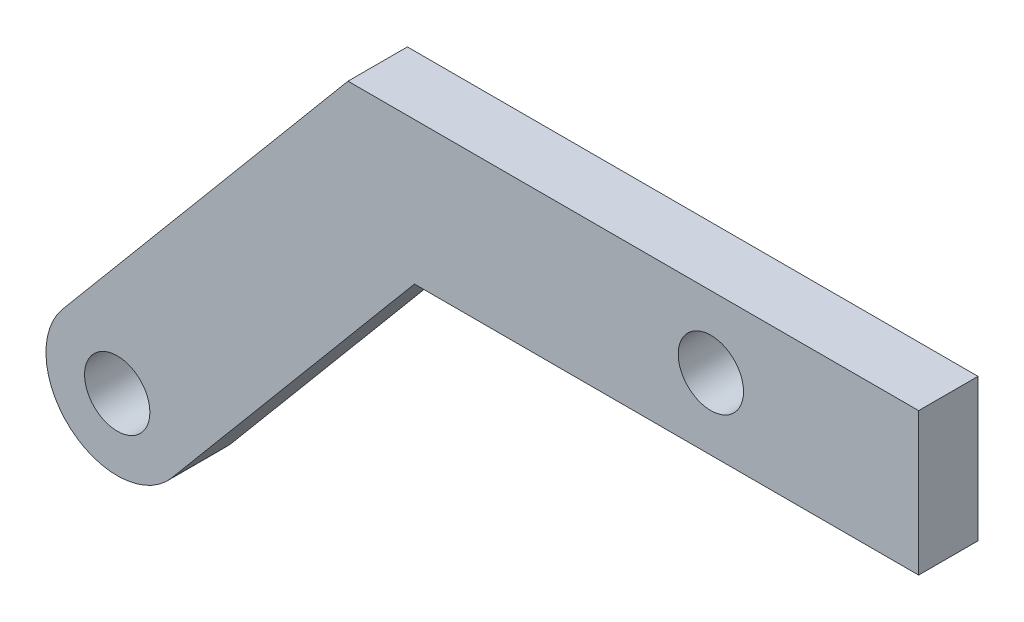
ISO-10303-21;
HEADER;
FILE_DESCRIPTION(('STEP AP214'),'2;1');
FILE_NAME('part.step','',(''),(''),'','','');
FILE_SCHEMA(('AUTOMOTIVE_DESIGN { 1 0 10303 214 1 1 1 1 }'));
ENDSEC;
DATA;
#1=APPLICATION_CONTEXT('core data for automotive mechanical design processes');
#2=APPLICATION_PROTOCOL_DEFINITION('international standard','automotive_design',2000,#1);
#3=PRODUCT_CONTEXT('',#1,'mechanical');
#4=PRODUCT('Part','Part','',(#3));
#5=PRODUCT_RELATED_PRODUCT_CATEGORY('part','',(#4));
#6=PRODUCT_DEFINITION_FORMATION('','',#4);
#7=PRODUCT_DEFINITION_CONTEXT('part definition',#1,'design');
#8=PRODUCT_DEFINITION('design','',#6,#7);
#9=PRODUCT_DEFINITION_SHAPE('','',#8);
#10=(LENGTH_UNIT() NAMED_UNIT(*) SI_UNIT(.MILLI.,.METRE.));
#11=(NAMED_UNIT(*) PLANE_ANGLE_UNIT() SI_UNIT($,.RADIAN.));
#12=(NAMED_UNIT(*) SI_UNIT($,.STERADIAN.) SOLID_ANGLE_UNIT());
#13=UNCERTAINTY_MEASURE_WITH_UNIT(LENGTH_MEASURE(1.E-05),#10,'distance_accuracy_value','');
#14=(GEOMETRIC_REPRESENTATION_CONTEXT(3) GLOBAL_UNCERTAINTY_ASSIGNED_CONTEXT((#13)) GLOBAL_UNIT_ASSIGNED_CONTEXT((#10,
#11,#12)) REPRESENTATION_CONTEXT('',''));
#15=CARTESIAN_POINT('',(0.,0.,0.));
#16=DIRECTION('',(0.,0.,1.));
#17=DIRECTION('',(1.,0.,0.));
#18=AXIS2_PLACEMENT_3D('',#15,#16,#17);
#19=CARTESIAN_POINT('',(0.,0.,10.));
#20=DIRECTION('',(0.,0.,-1.));
#21=DIRECTION('',(-1.,0.,0.));
#22=AXIS2_PLACEMENT_3D('',#19,#20,#21);
#23=CYLINDRICAL_SURFACE('',#22,12.);
#24=CARTESIAN_POINT('',(0.,0.,0.));
#25=DIRECTION('',(0.,0.,1.));
#26=DIRECTION('',(1.,0.,0.));
#27=AXIS2_PLACEMENT_3D('',#24,#25,#26);
#28=CIRCLE('',#27,12.);
#29=CARTESIAN_POINT('',(-9.19253331742775,7.71345131623845,0.));
#30=VERTEX_POINT('',#29);
#31=CARTESIAN_POINT('',(9.19253331742775,-7.71345131623846,0.));
#32=VERTEX_POINT('',#31);
#33=EDGE_CURVE('E135',#30,#32,#28,.T.);
#34=ORIENTED_EDGE('',*,*,#33,.T.);
#35=DIRECTION('',(0.,0.,-1.));
#36=VECTOR('',#35,1.);
#37=CARTESIAN_POINT('',(9.19253331742775,-7.71345131623846,10.));
#38=LINE('',#37,#36);
#39=CARTESIAN_POINT('',(9.19253331742775,-7.71345131623846,10.));
#40=VERTEX_POINT('',#39);
#41=EDGE_CURVE('E11',#40,#32,#38,.T.);
#42=ORIENTED_EDGE('',*,*,#41,.F.);
#43=CARTESIAN_POINT('',(0.,0.,10.));
#44=DIRECTION('',(0.,0.,1.));
#45=DIRECTION('',(1.,0.,0.));
#46=AXIS2_PLACEMENT_3D('',#43,#44,#45);
#47=CIRCLE('',#46,12.);
#48=CARTESIAN_POINT('',(-9.19253331742775,7.71345131623845,10.));
#49=VERTEX_POINT('',#48);
#50=EDGE_CURVE('E152',#49,#40,#47,.T.);
#51=ORIENTED_EDGE('',*,*,#50,.F.);
#52=DIRECTION('',(0.,0.,-1.));
#53=VECTOR('',#52,1.);
#54=CARTESIAN_POINT('',(-9.19253331742775,7.71345131623845,10.));
#55=LINE('',#54,#53);
#56=EDGE_CURVE('E60',#49,#30,#55,.T.);
#57=ORIENTED_EDGE('',*,*,#56,.T.);
#58=EDGE_LOOP('',(#34,#42,#51,#57));
#59=FACE_BOUND('',#58,.T.);
#60=ADVANCED_FACE('F41',(#59),#23,.T.);
#61=CARTESIAN_POINT('',(9.19253331742775,-7.71345131623846,10.));
#62=DIRECTION('',(-0.766044443118979,0.642787609686538,0.));
#63=DIRECTION('',(-0.642787609686538,-0.766044443118979,0.));
#64=AXIS2_PLACEMENT_3D('',#61,#62,#63);
#65=PLANE('',#64);
#66=DIRECTION('',(0.642787609686538,0.766044443118979,0.));
#67=VECTOR('',#66,1.);
#68=CARTESIAN_POINT('',(9.19253331742775,-7.71345131623846,0.));
#69=LINE('',#68,#67);
#70=CARTESIAN_POINT('',(50.0679723502557,41.,0.));
#71=VERTEX_POINT('',#70);
#72=EDGE_CURVE('E132',#32,#71,#69,.T.);
#73=ORIENTED_EDGE('',*,*,#72,.T.);
#74=DIRECTION('',(0.,0.,-1.));
#75=VECTOR('',#74,1.);
#76=CARTESIAN_POINT('',(50.0679723502557,41.,10.));
#77=LINE('',#76,#75);
#78=CARTESIAN_POINT('',(50.0679723502557,41.,10.));
#79=VERTEX_POINT('',#78);
#80=EDGE_CURVE('E47',#79,#71,#77,.T.);
#81=ORIENTED_EDGE('',*,*,#80,.F.);
#82=DIRECTION('',(0.642787609686538,0.766044443118979,0.));
#83=VECTOR('',#82,1.);
#84=CARTESIAN_POINT('',(9.19253331742775,-7.71345131623846,10.));
#85=LINE('',#84,#83);
#86=EDGE_CURVE('E87',#40,#79,#85,.T.);
#87=ORIENTED_EDGE('',*,*,#86,.F.);
#88=ORIENTED_EDGE('',*,*,#41,.T.);
#89=EDGE_LOOP('',(#73,#81,#87,#88));
#90=FACE_BOUND('',#89,.T.);
#91=ADVANCED_FACE('F156',(#90),#65,.F.);
#92=CARTESIAN_POINT('',(0.,41.,10.));
#93=DIRECTION('',(0.,-1.,0.));
#94=DIRECTION('',(1.,0.,0.));
#95=AXIS2_PLACEMENT_3D('',#92,#93,#94);
#96=PLANE('',#95);
#97=DIRECTION('',(-1.,0.,0.));
#98=VECTOR('',#97,1.);
#99=CARTESIAN_POINT('',(0.,41.,0.));
#100=LINE('',#99,#98);
#101=CARTESIAN_POINT('',(135.,41.,0.));
#102=VERTEX_POINT('',#101);
#103=EDGE_CURVE('E140',#102,#71,#100,.T.);
#104=ORIENTED_EDGE('',*,*,#103,.F.);
#105=DIRECTION('',(0.,0.,-1.));
#106=VECTOR('',#105,1.);
#107=CARTESIAN_POINT('',(135.,41.,10.));
#108=LINE('',#107,#106);
#109=CARTESIAN_POINT('',(135.,41.,10.));
#110=VERTEX_POINT('',#109);
#111=EDGE_CURVE('E109',#110,#102,#108,.T.);
#112=ORIENTED_EDGE('',*,*,#111,.F.);
#113=DIRECTION('',(-1.,0.,0.));
#114=VECTOR('',#113,1.);
#115=CARTESIAN_POINT('',(0.,41.,10.));
#116=LINE('',#115,#114);
#117=EDGE_CURVE('E119',#110,#79,#116,.T.);
#118=ORIENTED_EDGE('',*,*,#117,.T.);
#119=ORIENTED_EDGE('',*,*,#80,.T.);
#120=EDGE_LOOP('',(#104,#112,#118,#119));
#121=FACE_BOUND('',#120,.T.);
#122=ADVANCED_FACE('F160',(#121),#96,.T.);
#123=CARTESIAN_POINT('',(135.,-1.56125112837913E-13,10.));
#124=DIRECTION('',(1.,0.,0.));
#125=DIRECTION('',(0.,1.,0.));
#126=AXIS2_PLACEMENT_3D('',#123,#124,#125);
#127=PLANE('',#126);
#128=DIRECTION('',(0.,-1.,0.));
#129=VECTOR('',#128,1.);
#130=CARTESIAN_POINT('',(135.,-1.56125112837913E-13,0.));
#131=LINE('',#130,#129);
#132=CARTESIAN_POINT('',(135.,65.,0.));
#133=VERTEX_POINT('',#132);
#134=EDGE_CURVE('E101',#133,#102,#131,.T.);
#135=ORIENTED_EDGE('',*,*,#134,.F.);
#136=DIRECTION('',(0.,0.,-1.));
#137=VECTOR('',#136,1.);
#138=CARTESIAN_POINT('',(135.,65.,10.));
#139=LINE('',#138,#137);
#140=CARTESIAN_POINT('',(135.,65.,10.));
#141=VERTEX_POINT('',#140);
#142=EDGE_CURVE('E98',#141,#133,#139,.T.);
#143=ORIENTED_EDGE('',*,*,#142,.F.);
#144=DIRECTION('',(0.,-1.,0.));
#145=VECTOR('',#144,1.);
#146=CARTESIAN_POINT('',(135.,-1.56125112837913E-13,10.));
#147=LINE('',#146,#145);
#148=EDGE_CURVE('E105',#141,#110,#147,.T.);
#149=ORIENTED_EDGE('',*,*,#148,.T.);
#150=ORIENTED_EDGE('',*,*,#111,.T.);
#151=EDGE_LOOP('',(#135,#143,#149,#150));
#152=FACE_BOUND('',#151,.T.);
#153=ADVANCED_FACE('F102',(#152),#127,.T.);
#154=CARTESIAN_POINT('',(0.,65.,10.));
#155=DIRECTION('',(0.,1.,0.));
#156=DIRECTION('',(0.,0.,1.));
#157=AXIS2_PLACEMENT_3D('',#154,#155,#156);
#158=PLANE('',#157);
#159=DIRECTION('',(1.,0.,0.));
#160=VECTOR('',#159,1.);
#161=CARTESIAN_POINT('',(0.,65.,0.));
#162=LINE('',#161,#160);
#163=CARTESIAN_POINT('',(38.8765885545357,65.,0.));
#164=VERTEX_POINT('',#163);
#165=EDGE_CURVE('E141',#164,#133,#162,.T.);
#166=ORIENTED_EDGE('',*,*,#165,.F.);
#167=DIRECTION('',(0.,0.,-1.));
#168=VECTOR('',#167,1.);
#169=CARTESIAN_POINT('',(38.8765885545357,65.,10.));
#170=LINE('',#169,#168);
#171=CARTESIAN_POINT('',(38.8765885545357,65.,10.));
#172=VERTEX_POINT('',#171);
#173=EDGE_CURVE('E77',#172,#164,#170,.T.);
#174=ORIENTED_EDGE('',*,*,#173,.F.);
#175=DIRECTION('',(1.,0.,0.));
#176=VECTOR('',#175,1.);
#177=CARTESIAN_POINT('',(0.,65.,10.));
#178=LINE('',#177,#176);
#179=EDGE_CURVE('E116',#172,#141,#178,.T.);
#180=ORIENTED_EDGE('',*,*,#179,.T.);
#181=ORIENTED_EDGE('',*,*,#142,.T.);
#182=EDGE_LOOP('',(#166,#174,#180,#181));
#183=FACE_BOUND('',#182,.T.);
#184=ADVANCED_FACE('F120',(#183),#158,.T.);
#185=CARTESIAN_POINT('',(0.,0.,10.));
#186=DIRECTION('',(0.,0.,-1.));
#187=DIRECTION('',(-1.,0.,0.));
#188=AXIS2_PLACEMENT_3D('',#185,#186,#187);
#189=CYLINDRICAL_SURFACE('',#188,5.5);
#190=CARTESIAN_POINT('',(0.,0.,10.));
#191=DIRECTION('',(0.,0.,1.));
#192=DIRECTION('',(1.,0.,0.));
#193=AXIS2_PLACEMENT_3D('',#190,#191,#192);
#194=CIRCLE('',#193,5.5);
#195=CARTESIAN_POINT('',(5.5,0.,10.));
#196=VERTEX_POINT('',#195);
#197=EDGE_CURVE('E121',#196,#196,#194,.T.);
#198=ORIENTED_EDGE('',*,*,#197,.T.);
#199=EDGE_LOOP('',(#198));
#200=FACE_BOUND('',#199,.T.);
#201=CARTESIAN_POINT('',(0.,0.,0.));
#202=DIRECTION('',(0.,0.,1.));
#203=DIRECTION('',(1.,0.,0.));
#204=AXIS2_PLACEMENT_3D('',#201,#202,#203);
#205=CIRCLE('',#204,5.5);
#206=CARTESIAN_POINT('',(5.5,0.,0.));
#207=VERTEX_POINT('',#206);
#208=EDGE_CURVE('E147',#207,#207,#205,.T.);
#209=ORIENTED_EDGE('',*,*,#208,.F.);
#210=EDGE_LOOP('',(#209));
#211=FACE_BOUND('',#210,.T.);
#212=ADVANCED_FACE('F168',(#200,#211),#189,.F.);
#213=CARTESIAN_POINT('',(-9.19253331742775,7.71345131623846,10.));
#214=DIRECTION('',(-0.766044443118979,0.642787609686538,0.));
#215=DIRECTION('',(-0.642787609686538,-0.766044443118979,0.));
#216=AXIS2_PLACEMENT_3D('',#213,#214,#215);
#217=PLANE('',#216);
#218=DIRECTION('',(0.642787609686538,0.766044443118979,0.));
#219=VECTOR('',#218,1.);
#220=CARTESIAN_POINT('',(-9.19253331742775,7.71345131623846,0.));
#221=LINE('',#220,#219);
#222=EDGE_CURVE('E142',#30,#164,#221,.T.);
#223=ORIENTED_EDGE('',*,*,#222,.F.);
#224=ORIENTED_EDGE('',*,*,#56,.F.);
#225=DIRECTION('',(0.642787609686538,0.766044443118979,0.));
#226=VECTOR('',#225,1.);
#227=CARTESIAN_POINT('',(-9.19253331742775,7.71345131623846,10.));
#228=LINE('',#227,#226);
#229=EDGE_CURVE('E123',#49,#172,#228,.T.);
#230=ORIENTED_EDGE('',*,*,#229,.T.);
#231=ORIENTED_EDGE('',*,*,#173,.T.);
#232=EDGE_LOOP('',(#223,#224,#230,#231));
#233=FACE_BOUND('',#232,.T.);
#234=ADVANCED_FACE('F164',(#233),#217,.T.);
#235=CARTESIAN_POINT('',(100.,53.,10.));
#236=DIRECTION('',(0.,0.,-1.));
#237=DIRECTION('',(-1.,0.,0.));
#238=AXIS2_PLACEMENT_3D('',#235,#236,#237);
#239=CYLINDRICAL_SURFACE('',#238,5.5);
#240=CARTESIAN_POINT('',(100.,53.,10.));
#241=DIRECTION('',(0.,0.,1.));
#242=DIRECTION('',(1.,0.,0.));
#243=AXIS2_PLACEMENT_3D('',#240,#241,#242);
#244=CIRCLE('',#243,5.5);
#245=CARTESIAN_POINT('',(105.5,53.,10.));
#246=VERTEX_POINT('',#245);
#247=EDGE_CURVE('E129',#246,#246,#244,.T.);
#248=ORIENTED_EDGE('',*,*,#247,.T.);
#249=EDGE_LOOP('',(#248));
#250=FACE_BOUND('',#249,.T.);
#251=CARTESIAN_POINT('',(100.,53.,0.));
#252=DIRECTION('',(0.,0.,1.));
#253=DIRECTION('',(1.,0.,0.));
#254=AXIS2_PLACEMENT_3D('',#251,#252,#253);
#255=CIRCLE('',#254,5.5);
#256=CARTESIAN_POINT('',(105.5,53.,0.));
#257=VERTEX_POINT('',#256);
#258=EDGE_CURVE('E146',#257,#257,#255,.T.);
#259=ORIENTED_EDGE('',*,*,#258,.F.);
#260=EDGE_LOOP('',(#259));
#261=FACE_BOUND('',#260,.T.);
#262=ADVANCED_FACE('F165',(#250,#261),#239,.F.);
#263=CARTESIAN_POINT('',(0.,0.,10.));
#264=DIRECTION('',(0.,0.,1.));
#265=DIRECTION('',(1.,0.,0.));
#266=AXIS2_PLACEMENT_3D('',#263,#264,#265);
#267=PLANE('',#266);
#268=ORIENTED_EDGE('',*,*,#50,.T.);
#269=ORIENTED_EDGE('',*,*,#86,.T.);
#270=ORIENTED_EDGE('',*,*,#117,.F.);
#271=ORIENTED_EDGE('',*,*,#148,.F.);
#272=ORIENTED_EDGE('',*,*,#179,.F.);
#273=ORIENTED_EDGE('',*,*,#229,.F.);
#274=EDGE_LOOP('',(#268,#269,#270,#271,#272,#273));
#275=FACE_BOUND('',#274,.T.);
#276=ORIENTED_EDGE('',*,*,#197,.F.);
#277=EDGE_LOOP('',(#276));
#278=FACE_BOUND('',#277,.T.);
#279=ORIENTED_EDGE('',*,*,#247,.F.);
#280=EDGE_LOOP('',(#279));
#281=FACE_BOUND('',#280,.T.);
#282=ADVANCED_FACE('F111',(#275,#278,#281),#267,.T.);
#283=CARTESIAN_POINT('',(0.,0.,0.));
#284=DIRECTION('',(0.,0.,1.));
#285=DIRECTION('',(1.,0.,0.));
#286=AXIS2_PLACEMENT_3D('',#283,#284,#285);
#287=PLANE('',#286);
#288=ORIENTED_EDGE('',*,*,#33,.F.);
#289=ORIENTED_EDGE('',*,*,#222,.T.);
#290=ORIENTED_EDGE('',*,*,#165,.T.);
#291=ORIENTED_EDGE('',*,*,#134,.T.);
#292=ORIENTED_EDGE('',*,*,#103,.T.);
#293=ORIENTED_EDGE('',*,*,#72,.F.);
#294=EDGE_LOOP('',(#288,#289,#290,#291,#292,#293));
#295=FACE_BOUND('',#294,.T.);
#296=ORIENTED_EDGE('',*,*,#208,.T.);
#297=EDGE_LOOP('',(#296));
#298=FACE_BOUND('',#297,.T.);
#299=ORIENTED_EDGE('',*,*,#258,.T.);
#300=EDGE_LOOP('',(#299));
#301=FACE_BOUND('',#300,.T.);
#302=ADVANCED_FACE('F161',(#295,#298,#301),#287,.F.);
#303=CLOSED_SHELL('',(#60,#91,#122,#153,#184,#212,#234,#262,#282,#302));
#304=MANIFOLD_SOLID_BREP('B2',#303);
#305=ADVANCED_BREP_SHAPE_REPRESENTATION('',(#18,#304),#14);
#306=SHAPE_DEFINITION_REPRESENTATION(#9,#305);
ENDSEC;
END-ISO-10303-21;
